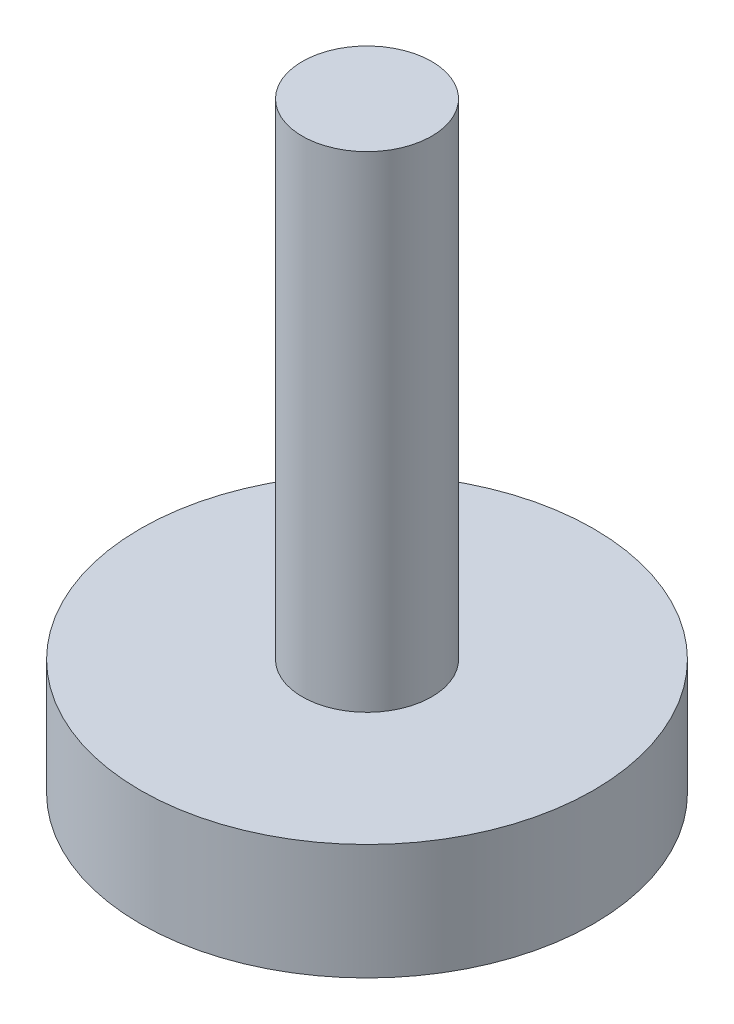
ISO-10303-21;
HEADER;
FILE_DESCRIPTION(('STEP AP214'),'2;1');
FILE_NAME('part.step','',(''),(''),'','','');
FILE_SCHEMA(('AUTOMOTIVE_DESIGN { 1 0 10303 214 1 1 1 1 }'));
ENDSEC;
DATA;
#1=APPLICATION_CONTEXT('core data for automotive mechanical design processes');
#2=APPLICATION_PROTOCOL_DEFINITION('international standard','automotive_design',2000,#1);
#3=PRODUCT_CONTEXT('',#1,'mechanical');
#4=PRODUCT('Part','Part','',(#3));
#5=PRODUCT_RELATED_PRODUCT_CATEGORY('part','',(#4));
#6=PRODUCT_DEFINITION_FORMATION('','',#4);
#7=PRODUCT_DEFINITION_CONTEXT('part definition',#1,'design');
#8=PRODUCT_DEFINITION('design','',#6,#7);
#9=PRODUCT_DEFINITION_SHAPE('','',#8);
#10=(LENGTH_UNIT() NAMED_UNIT(*) SI_UNIT(.MILLI.,.METRE.));
#11=(NAMED_UNIT(*) PLANE_ANGLE_UNIT() SI_UNIT($,.RADIAN.));
#12=(NAMED_UNIT(*) SI_UNIT($,.STERADIAN.) SOLID_ANGLE_UNIT());
#13=UNCERTAINTY_MEASURE_WITH_UNIT(LENGTH_MEASURE(1.E-05),#10,'distance_accuracy_value','');
#14=(GEOMETRIC_REPRESENTATION_CONTEXT(3) GLOBAL_UNCERTAINTY_ASSIGNED_CONTEXT((#13)) GLOBAL_UNIT_ASSIGNED_CONTEXT((#10,
#11,#12)) REPRESENTATION_CONTEXT('',''));
#15=CARTESIAN_POINT('',(0.,0.,0.));
#16=DIRECTION('',(0.,0.,1.));
#17=DIRECTION('',(1.,0.,0.));
#18=AXIS2_PLACEMENT_3D('',#15,#16,#17);
#19=CARTESIAN_POINT('',(0.,130.,0.));
#20=DIRECTION('',(0.,1.,0.));
#21=DIRECTION('',(0.,0.,1.));
#22=AXIS2_PLACEMENT_3D('',#19,#20,#21);
#23=PLANE('',#22);
#24=CARTESIAN_POINT('',(0.,130.,0.));
#25=DIRECTION('',(0.,-1.,0.));
#26=DIRECTION('',(0.,0.,-1.));
#27=AXIS2_PLACEMENT_3D('',#24,#25,#26);
#28=CIRCLE('',#27,14.);
#29=CARTESIAN_POINT('',(0.,130.,-14.));
#30=VERTEX_POINT('',#29);
#31=EDGE_CURVE('E17',#30,#30,#28,.T.);
#32=ORIENTED_EDGE('',*,*,#31,.F.);
#33=EDGE_LOOP('',(#32));
#34=FACE_BOUND('',#33,.T.);
#35=ADVANCED_FACE('F14',(#34),#23,.T.);
#36=CARTESIAN_POINT('',(0.,130.,0.));
#37=DIRECTION('',(0.,-1.,0.));
#38=DIRECTION('',(0.,0.,-1.));
#39=AXIS2_PLACEMENT_3D('',#36,#37,#38);
#40=CYLINDRICAL_SURFACE('',#39,14.);
#41=CARTESIAN_POINT('',(0.,25.,0.));
#42=DIRECTION('',(0.,-1.,0.));
#43=DIRECTION('',(0.,0.,-1.));
#44=AXIS2_PLACEMENT_3D('',#41,#42,#43);
#45=CIRCLE('',#44,14.);
#46=CARTESIAN_POINT('',(0.,25.,-14.));
#47=VERTEX_POINT('',#46);
#48=EDGE_CURVE('E26',#47,#47,#45,.T.);
#49=ORIENTED_EDGE('',*,*,#48,.F.);
#50=EDGE_LOOP('',(#49));
#51=FACE_BOUND('',#50,.T.);
#52=ORIENTED_EDGE('',*,*,#31,.T.);
#53=EDGE_LOOP('',(#52));
#54=FACE_BOUND('',#53,.T.);
#55=ADVANCED_FACE('F34',(#51,#54),#40,.T.);
#56=CARTESIAN_POINT('',(0.,25.,0.));
#57=DIRECTION('',(0.,1.,0.));
#58=DIRECTION('',(0.,0.,1.));
#59=AXIS2_PLACEMENT_3D('',#56,#57,#58);
#60=PLANE('',#59);
#61=ORIENTED_EDGE('',*,*,#48,.T.);
#62=EDGE_LOOP('',(#61));
#63=FACE_BOUND('',#62,.T.);
#64=CARTESIAN_POINT('',(0.,25.,0.));
#65=DIRECTION('',(0.,-1.,0.));
#66=DIRECTION('',(0.,0.,-1.));
#67=AXIS2_PLACEMENT_3D('',#64,#65,#66);
#68=CIRCLE('',#67,49.);
#69=CARTESIAN_POINT('',(0.,25.,-49.));
#70=VERTEX_POINT('',#69);
#71=EDGE_CURVE('E21',#70,#70,#68,.T.);
#72=ORIENTED_EDGE('',*,*,#71,.F.);
#73=EDGE_LOOP('',(#72));
#74=FACE_BOUND('',#73,.T.);
#75=ADVANCED_FACE('F42',(#63,#74),#60,.T.);
#76=CARTESIAN_POINT('',(0.,25.,0.));
#77=DIRECTION('',(0.,-1.,0.));
#78=DIRECTION('',(0.,0.,-1.));
#79=AXIS2_PLACEMENT_3D('',#76,#77,#78);
#80=CYLINDRICAL_SURFACE('',#79,49.);
#81=ORIENTED_EDGE('',*,*,#71,.T.);
#82=EDGE_LOOP('',(#81));
#83=FACE_BOUND('',#82,.T.);
#84=CARTESIAN_POINT('',(0.,0.,0.));
#85=DIRECTION('',(0.,-1.,0.));
#86=DIRECTION('',(0.,0.,-1.));
#87=AXIS2_PLACEMENT_3D('',#84,#85,#86);
#88=CIRCLE('',#87,49.);
#89=CARTESIAN_POINT('',(0.,0.,-49.));
#90=VERTEX_POINT('',#89);
#91=EDGE_CURVE('E10',#90,#90,#88,.F.);
#92=ORIENTED_EDGE('',*,*,#91,.T.);
#93=EDGE_LOOP('',(#92));
#94=FACE_BOUND('',#93,.T.);
#95=ADVANCED_FACE('F46',(#83,#94),#80,.T.);
#96=CARTESIAN_POINT('',(0.,0.,0.));
#97=DIRECTION('',(0.,1.,0.));
#98=DIRECTION('',(0.,0.,1.));
#99=AXIS2_PLACEMENT_3D('',#96,#97,#98);
#100=PLANE('',#99);
#101=ORIENTED_EDGE('',*,*,#91,.F.);
#102=EDGE_LOOP('',(#101));
#103=FACE_BOUND('',#102,.T.);
#104=ADVANCED_FACE('F44',(#103),#100,.F.);
#105=CLOSED_SHELL('',(#35,#55,#75,#95,#104));
#106=MANIFOLD_SOLID_BREP('B1',#105);
#107=ADVANCED_BREP_SHAPE_REPRESENTATION('',(#18,#106),#14);
#108=SHAPE_DEFINITION_REPRESENTATION(#9,#107);
ENDSEC;
END-ISO-10303-21;
